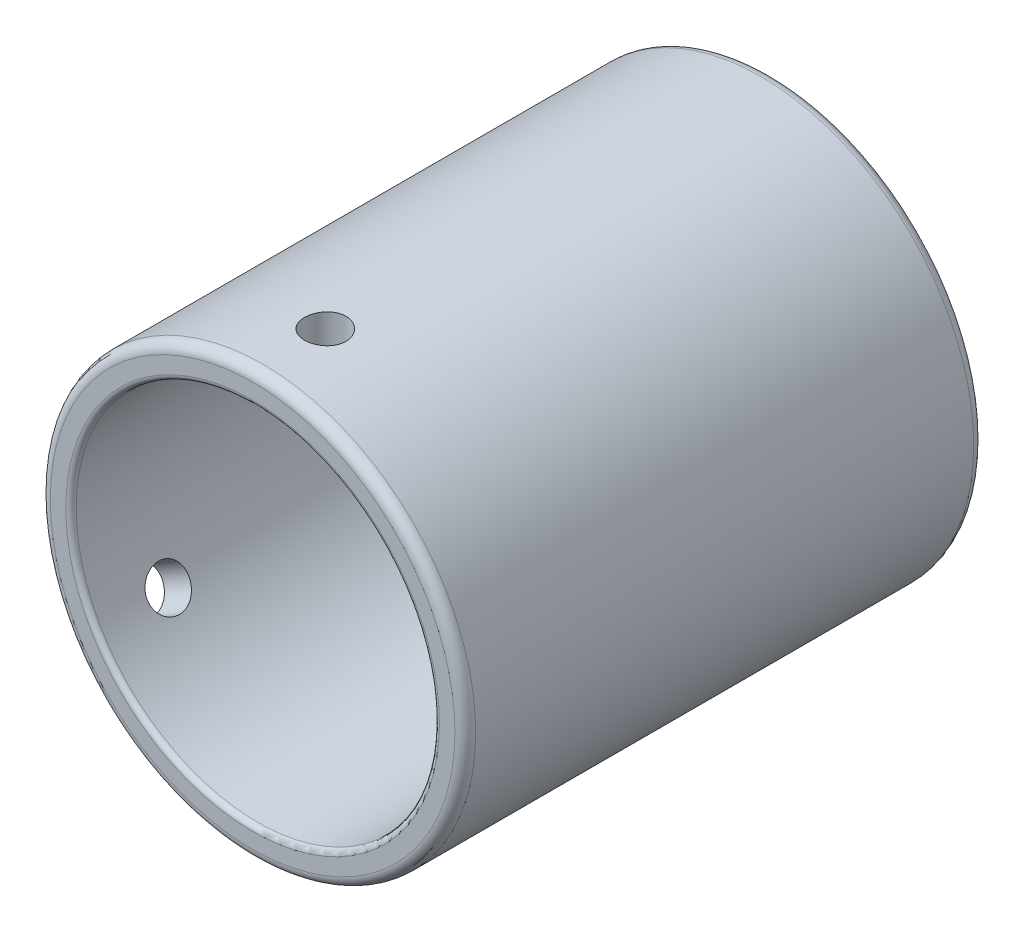
ISO-10303-21;
HEADER;
FILE_DESCRIPTION(('STEP AP214'),'2;1');
FILE_NAME('part.step','',(''),(''),'','','');
FILE_SCHEMA(('AUTOMOTIVE_DESIGN { 1 0 10303 214 1 1 1 1 }'));
ENDSEC;
DATA;
#1=APPLICATION_CONTEXT('core data for automotive mechanical design processes');
#2=APPLICATION_PROTOCOL_DEFINITION('international standard','automotive_design',2000,#1);
#3=PRODUCT_CONTEXT('',#1,'mechanical');
#4=PRODUCT('Part','Part','',(#3));
#5=PRODUCT_RELATED_PRODUCT_CATEGORY('part','',(#4));
#6=PRODUCT_DEFINITION_FORMATION('','',#4);
#7=PRODUCT_DEFINITION_CONTEXT('part definition',#1,'design');
#8=PRODUCT_DEFINITION('design','',#6,#7);
#9=PRODUCT_DEFINITION_SHAPE('','',#8);
#10=(LENGTH_UNIT() NAMED_UNIT(*) SI_UNIT(.MILLI.,.METRE.));
#11=(NAMED_UNIT(*) PLANE_ANGLE_UNIT() SI_UNIT($,.RADIAN.));
#12=(NAMED_UNIT(*) SI_UNIT($,.STERADIAN.) SOLID_ANGLE_UNIT());
#13=UNCERTAINTY_MEASURE_WITH_UNIT(LENGTH_MEASURE(1.E-05),#10,'distance_accuracy_value','');
#14=(GEOMETRIC_REPRESENTATION_CONTEXT(3) GLOBAL_UNCERTAINTY_ASSIGNED_CONTEXT((#13)) GLOBAL_UNIT_ASSIGNED_CONTEXT((#10,
#11,#12)) REPRESENTATION_CONTEXT('',''));
#15=CARTESIAN_POINT('',(0.,0.,0.));
#16=DIRECTION('',(0.,0.,1.));
#17=DIRECTION('',(1.,0.,0.));
#18=AXIS2_PLACEMENT_3D('',#15,#16,#17);
#19=CARTESIAN_POINT('',(0.,0.,-20.));
#20=DIRECTION('',(0.,0.,1.));
#21=DIRECTION('',(1.,0.,0.));
#22=AXIS2_PLACEMENT_3D('',#19,#20,#21);
#23=CYLINDRICAL_SURFACE('',#22,20.5);
#24=CARTESIAN_POINT('',(0.,0.,-19.));
#25=DIRECTION('',(0.,0.,1.));
#26=DIRECTION('',(1.,0.,0.));
#27=AXIS2_PLACEMENT_3D('',#24,#25,#26);
#28=CIRCLE('',#27,20.5);
#29=CARTESIAN_POINT('',(20.5,0.,-19.));
#30=VERTEX_POINT('',#29);
#31=EDGE_CURVE('E72',#30,#30,#28,.T.);
#32=ORIENTED_EDGE('',*,*,#31,.T.);
#33=EDGE_LOOP('',(#32));
#34=FACE_BOUND('',#33,.T.);
#35=CARTESIAN_POINT('',(0.,0.,29.));
#36=DIRECTION('',(0.,0.,1.));
#37=DIRECTION('',(1.,0.,0.));
#38=AXIS2_PLACEMENT_3D('',#35,#36,#37);
#39=CIRCLE('',#38,20.5);
#40=CARTESIAN_POINT('',(20.5,0.,29.));
#41=VERTEX_POINT('',#40);
#42=EDGE_CURVE('E76',#41,#41,#39,.F.);
#43=ORIENTED_EDGE('',*,*,#42,.T.);
#44=EDGE_LOOP('',(#43));
#45=FACE_BOUND('',#44,.T.);
#46=CARTESIAN_POINT('',(0.,20.5,21.));
#47=CARTESIAN_POINT('',(0.112055118297261,20.4999987386317,21.0000048593988));
#48=CARTESIAN_POINT('',(0.224184668309975,20.499071475106,21.0094489636002));
#49=CARTESIAN_POINT('',(0.445336088255295,20.495461599852,21.0469813336016));
#50=CARTESIAN_POINT('',(0.554354379701426,20.492777045632,21.075090231774));
#51=CARTESIAN_POINT('',(0.766048698073126,20.4859556789613,21.1491269722291));
#52=CARTESIAN_POINT('',(0.868728474939646,20.4818197350429,21.1950441595022));
#53=CARTESIAN_POINT('',(1.06490075245513,20.4725582727556,21.3033736252023));
#54=CARTESIAN_POINT('',(1.15839509656164,20.4674329535627,21.3657825845213));
#55=CARTESIAN_POINT('',(1.33388629714277,20.4567473510947,21.5055541918637));
#56=CARTESIAN_POINT('',(1.41584720019146,20.4511857883102,21.5829618878313));
#57=CARTESIAN_POINT('',(1.56563601183513,20.440265125924,21.7504376815717));
#58=CARTESIAN_POINT('',(1.63346327204389,20.43490603562,21.8405063598547));
#59=CARTESIAN_POINT('',(1.75318595977495,20.4249839183537,22.0309713758884));
#60=CARTESIAN_POINT('',(1.80504898753962,20.420422518314,22.1313881715299));
#61=CARTESIAN_POINT('',(1.89116411593102,20.4126279274825,22.3395569917273));
#62=CARTESIAN_POINT('',(1.92541663199883,20.4093947053588,22.4473088431773));
#63=CARTESIAN_POINT('',(1.97523217537074,20.4046339961254,22.6667233177343));
#64=CARTESIAN_POINT('',(1.99085468574775,20.4031010812673,22.7783723161546));
#65=CARTESIAN_POINT('',(2.00315060766216,20.4018976534529,23.0027173911622));
#66=CARTESIAN_POINT('',(1.99982449475686,20.4022270937568,23.1154134414005));
#67=CARTESIAN_POINT('',(1.97436663428334,20.4047062007368,23.338243935767));
#68=CARTESIAN_POINT('',(1.95229978651287,20.4068495855721,23.4483858742493));
#69=CARTESIAN_POINT('',(1.89008781141722,20.4127052572463,23.6633953754961));
#70=CARTESIAN_POINT('',(1.84994245048147,20.4164175643586,23.7682628700848));
#71=CARTESIAN_POINT('',(1.7526412298465,20.4250000260275,23.9699519795444));
#72=CARTESIAN_POINT('',(1.6954565253236,20.4298721411142,24.0667595919421));
#73=CARTESIAN_POINT('',(1.56572061882715,20.440223572557,24.2494277136336));
#74=CARTESIAN_POINT('',(1.49316898890145,20.4457029058215,24.3352879179474));
#75=CARTESIAN_POINT('',(1.33439598480994,20.4566793757017,24.4940011334619));
#76=CARTESIAN_POINT('',(1.2481185525419,20.462176490598,24.5667980787225));
#77=CARTESIAN_POINT('',(1.06453784366295,20.4725474048768,24.6968839513002));
#78=CARTESIAN_POINT('',(0.967234555575785,20.4774212036104,24.7541728624756));
#79=CARTESIAN_POINT('',(0.764325751896327,20.4859978296919,24.8516140005771));
#80=CARTESIAN_POINT('',(0.658718889055996,20.4897004665282,24.8917634398159));
#81=CARTESIAN_POINT('',(0.44221879203114,20.4955156024944,24.953745138046));
#82=CARTESIAN_POINT('',(0.3313257083909,20.4976281468793,24.9755779183415));
#83=CARTESIAN_POINT('',(0.107886619670565,20.500019258317,25.000235550754));
#84=CARTESIAN_POINT('',(-0.00465076973347534,20.500305291138,25.0031377815235));
#85=CARTESIAN_POINT('',(-0.228610375518432,20.4990311576163,24.9900550811019));
#86=CARTESIAN_POINT('',(-0.340032606208692,20.4974710149938,24.9740703925754));
#87=CARTESIAN_POINT('',(-0.558376115530064,20.4926846542083,24.923731784933));
#88=CARTESIAN_POINT('',(-0.665305811782584,20.4894617173387,24.8894140388491));
#89=CARTESIAN_POINT('',(-0.871890422192229,20.4817114137955,24.8034206092611));
#90=CARTESIAN_POINT('',(-0.971545180657102,20.4771840192152,24.7517445544012));
#91=CARTESIAN_POINT('',(-1.1611012962819,20.4673127926895,24.6323090995056));
#92=CARTESIAN_POINT('',(-1.25097044326885,20.4619663961097,24.5644987940307));
#93=CARTESIAN_POINT('',(-1.41807837639946,20.4510654935712,24.4147927993274));
#94=CARTESIAN_POINT('',(-1.49531686095596,20.445510982647,24.3328967738646));
#95=CARTESIAN_POINT('',(-1.6352391099201,20.4347974735107,24.1570067296608));
#96=CARTESIAN_POINT('',(-1.69787213595757,20.4296398945817,24.0629722494476));
#97=CARTESIAN_POINT('',(-1.806456889884,20.420325565535,23.865674446725));
#98=CARTESIAN_POINT('',(-1.85240883634839,20.4161688023037,23.7624112451633));
#99=CARTESIAN_POINT('',(-1.92624184829733,20.4093354686106,23.549762158182));
#100=CARTESIAN_POINT('',(-1.95415324003956,20.4066564152293,23.4403868853055));
#101=CARTESIAN_POINT('',(-1.99121129222791,20.4030740265505,23.2184747902894));
#102=CARTESIAN_POINT('',(-2.00035846262235,20.4021706429962,23.105938054152));
#103=CARTESIAN_POINT('',(-1.99962152986922,20.4022428445945,22.881401828145));
#104=CARTESIAN_POINT('',(-1.98981713237009,20.403210560367,22.7694020656052));
#105=CARTESIAN_POINT('',(-1.9516223500197,20.4068991531074,22.5486486645367));
#106=CARTESIAN_POINT('',(-1.92323194295228,20.4096200321709,22.4398950298884));
#107=CARTESIAN_POINT('',(-1.84869275783853,20.4165062113761,22.2287207086669));
#108=CARTESIAN_POINT('',(-1.80254618103738,20.4206713324678,22.1262992389169));
#109=CARTESIAN_POINT('',(-1.69381289802922,20.4299770492896,21.9306430701679));
#110=CARTESIAN_POINT('',(-1.63122630987085,20.4351176380153,21.8374083052099));
#111=CARTESIAN_POINT('',(-1.49109015247852,20.445820950492,21.6623636819851));
#112=CARTESIAN_POINT('',(-1.4134812275986,20.4513852938365,21.5806014403538));
#113=CARTESIAN_POINT('',(-1.24561975044232,20.4622943497929,21.4312248718465));
#114=CARTESIAN_POINT('',(-1.15536416941485,20.4676390093949,21.3636139437738));
#115=CARTESIAN_POINT('',(-0.96453486672606,20.477519777667,21.2443323754535));
#116=CARTESIAN_POINT('',(-0.863936776040608,20.4820539044482,21.1927005876381));
#117=CARTESIAN_POINT('',(-0.655519466416636,20.4897809682009,21.1071301224197));
#118=CARTESIAN_POINT('',(-0.547708571075021,20.4929754212287,21.0731714345133));
#119=CARTESIAN_POINT('',(-0.36606935911458,20.4968577956736,21.0324073778325));
#120=CARTESIAN_POINT('',(-0.293403317049334,20.4980306482258,21.0202711442945));
#121=CARTESIAN_POINT('',(-0.147168884711894,20.4996021631359,21.0040658751404));
#122=CARTESIAN_POINT('',(-0.0736004979412026,20.500000828497,20.9999968082299));
#123=CARTESIAN_POINT('',(0.,20.5,21.));
#124=B_SPLINE_CURVE_WITH_KNOTS('',3,(#46,#47,#48,#49,#50,#51,#52,#53,#54,#55,#56,#57,#58,#59,
#60,#61,#62,#63,#64,#65,#66,#67,#68,#69,#70,#71,#72,#73,#74,#75,#76,#77,#78,#79,#80,#81,#82,#83,
#84,#85,#86,#87,#88,#89,#90,#91,#92,#93,#94,#95,#96,#97,#98,#99,#100,#101,#102,#103,#104,#105,
#106,#107,#108,#109,#110,#111,#112,#113,#114,#115,#116,#117,#118,#119,#120,#121,#122,#123),
.UNSPECIFIED.,.T.,.F.,(4,2,2,2,2,2,2,2,2,2,2,2,2,2,2,2,2,2,2,2,2,2,2,2,2,2,2,2,2,2,2,2,2,2,2,2,
2,2,4),(0.,0.335896599613497,0.672165124399248,1.00823276348817,1.34423281758225,
1.68125812727404,2.01829889472738,2.35601925108154,2.69373164007187,3.03036284743265,
3.36698560633152,3.70244736052759,4.03791344968535,4.37395068598548,4.70999728178776,
5.04745334324658,5.38490975594947,5.72242103410455,6.059922706139,6.39604397039323,
6.73216091610808,7.06761710439,7.40308046972677,7.7396166341872,8.07616083307704,
8.41385730311551,8.75154934809143,9.08867224454342,9.42578597900947,9.76148498018371,
10.097184382625,10.4328421815703,10.7684975703674,11.105507305527,11.442597889628,
11.7805017665503,12.1180222122315,12.3386480369782,12.5592730058683),.UNSPECIFIED.);
#125=CARTESIAN_POINT('',(0.,20.5,21.));
#126=VERTEX_POINT('',#125);
#127=EDGE_CURVE('E80',#126,#126,#124,.T.);
#128=ORIENTED_EDGE('',*,*,#127,.T.);
#129=EDGE_LOOP('',(#128));
#130=FACE_BOUND('',#129,.T.);
#131=CARTESIAN_POINT('',(-17.7535207775809,-10.2500000000001,21.));
#132=CARTESIAN_POINT('',(-17.8095472443526,-10.1529567902465,21.0000048593988));
#133=CARTESIAN_POINT('',(-17.8648089855897,-10.0553861196577,21.0094489636002));
#134=CARTESIAN_POINT('',(-17.9722584518879,-9.86205843427499,21.0469813336016));
#135=CARTESIAN_POINT('',(-18.0244427054586,-9.76630354729549,21.075090231774));
#136=CARTESIAN_POINT('',(-18.1243823878191,-9.57956020641342,21.1491269722291));
#137=CARTESIAN_POINT('',(-18.1721404437504,-9.48856893923288,21.1950441595022));
#138=CARTESIAN_POINT('',(-18.2622059208911,-9.31404803224257,21.3033736252023));
#139=CARTESIAN_POINT('',(-18.3045144363209,-9.23051689553974,21.3657825845213));
#140=CARTESIAN_POINT('',(-18.3830060334194,-9.07319425646183,21.5055541918637));
#141=CARTESIAN_POINT('',(-18.4191700302876,-8.9994332509123,21.5829618878313));
#142=CARTESIAN_POINT('',(-18.4846068650568,-8.8642520036331,21.7504376815717));
#143=CARTESIAN_POINT('',(-18.5138793868168,-8.80283232807125,21.8405063598547));
#144=CARTESIAN_POINT('',(-18.5651479250703,-8.69418838045362,22.0309713758884));
#145=CARTESIAN_POINT('',(-18.5871291506415,-8.64699298087237,22.1313881715299));
#146=CARTESIAN_POINT('',(-18.623436401165,-8.56851779661955,22.3395569917273));
#147=CARTESIAN_POINT('',(-18.6377626067037,-8.53723763649942,22.4473088431773));
#148=CARTESIAN_POINT('',(-18.6585474832535,-8.49171575581933,22.6667233177343));
#149=CARTESIAN_POINT('',(-18.665031195233,-8.47741980753288,22.7783723161546));
#150=CARTESIAN_POINT('',(-18.6701369571314,-8.46616951288487,23.0027173911622));
#151=CARTESIAN_POINT('',(-18.6687592043509,-8.46921473130865,23.1154134414005));
#152=CARTESIAN_POINT('',(-18.6581772437375,-8.49250143869471,23.338243935767));
#153=CARTESIAN_POINT('',(-18.6490000455698,-8.51268358186308,23.4483858742493));
#154=CARTESIAN_POINT('',(-18.622965218448,-8.56948856855259,23.6633953754961));
#155=CARTESIAN_POINT('',(-18.6061074902461,-8.60611162452322,23.7682628700848));
#156=CARTESIAN_POINT('',(-18.5648895097609,-8.69466818424677,23.9699519795444));
#157=CARTESIAN_POINT('',(-18.5405165329346,-8.74662764861486,24.0667595919421));
#158=CARTESIAN_POINT('',(-18.4846131822814,-8.8641579551452,24.2494277136336));
#159=CARTESIAN_POINT('',(-18.4530826091214,-8.92972917637905,24.3352879179474));
#160=CARTESIAN_POINT('',(-18.3832020088358,-9.07271886629758,24.4940011334619));
#161=CARTESIAN_POINT('',(-18.3448239338495,-9.15018587186315,24.5667980787225));
#162=CARTESIAN_POINT('',(-18.2620150546359,-9.31435688653645,24.6968839513002));
#163=CARTESIAN_POINT('',(-18.2175842441086,-9.40106090525851,24.7541728624756));
#164=CARTESIAN_POINT('',(-18.1235574183342,-9.58107339693719,24.8516140005771));
#165=CARTESIAN_POINT('',(-18.0739605644753,-9.67438294138904,24.8917634398159));
#166=CARTESIAN_POINT('',(-17.970746571436,-9.86478509331747,24.953745138046));
#167=CARTESIAN_POINT('',(-17.9171295467198,-9.96187759304633,24.9755779183415));
#168=CARTESIAN_POINT('',(-17.807480765608,-10.1565770757955,25.000235550754));
#169=CARTESIAN_POINT('',(-17.7514597825953,-10.2541803303054,25.0031377815235));
#170=CARTESIAN_POINT('',(-17.6383765477052,-10.4474979715759,24.9900550811019));
#171=CARTESIAN_POINT('',(-17.5813143092155,-10.5432123825888,24.9740703925754));
#172=CARTESIAN_POINT('',(-17.4679974445228,-10.7299102280197,24.923731784933));
#173=CARTESIAN_POINT('',(-17.4117414511927,-10.8209025929586,24.8894140388491));
#174=CARTESIAN_POINT('',(-17.3017371862324,-10.9959349618326,24.8034206092611));
#175=CARTESIAN_POINT('',(-17.2479889682805,-11.0799748169811,24.7517445544012));
#176=CARTESIAN_POINT('',(-17.1446621775303,-11.239199615292,24.6323090995056));
#177=CARTESIAN_POINT('',(-17.0950974887801,-11.3143553813093,24.5644987940307));
#178=CARTESIAN_POINT('',(-17.0021030636922,-11.453624645305,24.4147927993274));
#179=CARTESIAN_POINT('',(-16.958673473848,-11.5177378796186,24.3328967738646));
#180=CARTESIAN_POINT('',(-16.8794341782902,-11.6335573472081,24.1570067296608));
#181=CARTESIAN_POINT('',(-16.8436510708969,-11.6852203494079,24.0629722494476));
#182=CARTESIAN_POINT('',(-16.7812922483601,-11.7746003402485,23.865674446725));
#183=CARTESIAN_POINT('',(-16.754716412572,-11.8123175116244,23.7624112451633));
#184=CARTESIAN_POINT('',(-16.7118820660268,-11.8728421087635,23.549762158182));
#185=CARTESIAN_POINT('',(-16.6956062418694,-11.8956745563767,23.4403868853055));
#186=CARTESIAN_POINT('',(-16.6739747761731,-11.9259765766471,23.2184747902894));
#187=CARTESIAN_POINT('',(-16.6686188378686,-11.9334465668043,23.105938054152));
#188=CARTESIAN_POINT('',(-16.6690498326635,-11.9328444651184,22.881401828145));
#189=CARTESIAN_POINT('',(-16.6747900978557,-11.9248374657016,22.7694020656052));
#190=CARTESIAN_POINT('',(-16.6970819040483,-11.8936041102643,22.5486486645367));
#191=CARTESIAN_POINT('',(-16.7136334579716,-11.8703777360519,22.4398950298884));
#192=CARTESIAN_POINT('',(-16.7568666566552,-11.8092679977686,22.2287207086669));
#193=CARTESIAN_POINT('',(-16.7835470457309,-11.771386450507,22.1262992389169));
#194=CARTESIAN_POINT('',(-16.8459726744032,-11.6818735235959,21.9306430701679));
#195=CARTESIAN_POINT('',(-16.8817178489092,-11.6302422426774,21.8374083052099));
#196=CARTESIAN_POINT('',(-16.9610552681149,-11.5142324266253,21.6623636819851));
#197=CARTESIAN_POINT('',(-17.0046785932466,-11.4498032977912,21.5806014403538));
#198=CARTESIAN_POINT('',(-17.0980568514142,-11.3098855222352,21.4312248718465));
#199=CARTESIAN_POINT('',(-17.1478132529179,-11.2343942260331,21.3636139437738));
#200=CARTESIAN_POINT('',(-17.2517849005948,-11.0740715862542,21.2443323754535));
#201=CARTESIAN_POINT('',(-17.306010614914,-10.989218147539,21.1927005876381));
#202=CARTESIAN_POINT('',(-17.4169111032325,-10.8125869946926,21.1071301224197));
#203=CARTESIAN_POINT('',(-17.4735830283766,-10.7208172470359,21.0731714345133));
#204=CARTESIAN_POINT('',(-17.5677648692531,-10.5654542623772,21.0324073778325));
#205=CARTESIAN_POINT('',(-17.6051136103909,-10.5031100502323,21.0202711442945));
#206=CARTESIAN_POINT('',(-17.6795917983941,-10.3772530743752,21.0040658751404));
#207=CARTESIAN_POINT('',(-17.7167212461098,-10.3137403151969,20.9999968082299));
#208=CARTESIAN_POINT('',(-17.7535207775809,-10.2500000000001,21.));
#209=B_SPLINE_CURVE_WITH_KNOTS('',3,(#131,#132,#133,#134,#135,#136,#137,#138,#139,#140,#141,
#142,#143,#144,#145,#146,#147,#148,#149,#150,#151,#152,#153,#154,#155,#156,#157,#158,#159,#160,
#161,#162,#163,#164,#165,#166,#167,#168,#169,#170,#171,#172,#173,#174,#175,#176,#177,#178,#179,
#180,#181,#182,#183,#184,#185,#186,#187,#188,#189,#190,#191,#192,#193,#194,#195,#196,#197,#198,
#199,#200,#201,#202,#203,#204,#205,#206,#207,#208),.UNSPECIFIED.,.T.,.F.,(4,2,2,2,2,2,2,2,2,2,2,
2,2,2,2,2,2,2,2,2,2,2,2,2,2,2,2,2,2,2,2,2,2,2,2,2,2,2,4),(0.,0.335896599613497,
0.672165124399248,1.00823276348817,1.34423281758225,1.68125812727404,2.01829889472738,
2.35601925108154,2.69373164007187,3.03036284743265,3.36698560633152,3.70244736052759,
4.03791344968535,4.37395068598548,4.70999728178776,5.04745334324658,5.38490975594948,
5.72242103410455,6.05992270613901,6.39604397039323,6.73216091610809,7.06761710439,
7.40308046972677,7.7396166341872,8.07616083307704,8.41385730311551,8.75154934809143,
9.08867224454342,9.42578597900947,9.76148498018371,10.097184382625,10.4328421815703,
10.7684975703674,11.105507305527,11.442597889628,11.7805017665503,12.1180222122315,
12.3386480369782,12.5592730058683),.UNSPECIFIED.);
#210=CARTESIAN_POINT('',(-17.7535207775809,-10.2500000000001,21.));
#211=VERTEX_POINT('',#210);
#212=EDGE_CURVE('E157',#211,#211,#209,.T.);
#213=ORIENTED_EDGE('',*,*,#212,.T.);
#214=EDGE_LOOP('',(#213));
#215=FACE_BOUND('',#214,.T.);
#216=ADVANCED_FACE('F40',(#34,#45,#130,#215),#23,.T.);
#217=CARTESIAN_POINT('',(0.,0.,-20.));
#218=DIRECTION('',(0.,0.,1.));
#219=DIRECTION('',(1.,0.,0.));
#220=AXIS2_PLACEMENT_3D('',#217,#218,#219);
#221=CYLINDRICAL_SURFACE('',#220,17.5);
#222=CARTESIAN_POINT('',(0.,0.,-19.5));
#223=DIRECTION('',(0.,0.,1.));
#224=DIRECTION('',(1.,0.,0.));
#225=AXIS2_PLACEMENT_3D('',#222,#223,#224);
#226=CIRCLE('',#225,17.5);
#227=CARTESIAN_POINT('',(17.5,0.,-19.5));
#228=VERTEX_POINT('',#227);
#229=EDGE_CURVE('E48',#228,#228,#226,.F.);
#230=ORIENTED_EDGE('',*,*,#229,.T.);
#231=EDGE_LOOP('',(#230));
#232=FACE_BOUND('',#231,.T.);
#233=CARTESIAN_POINT('',(0.,0.,29.5));
#234=DIRECTION('',(0.,0.,1.));
#235=DIRECTION('',(1.,0.,0.));
#236=AXIS2_PLACEMENT_3D('',#233,#234,#235);
#237=CIRCLE('',#236,17.5);
#238=CARTESIAN_POINT('',(17.5,0.,29.5));
#239=VERTEX_POINT('',#238);
#240=EDGE_CURVE('E53',#239,#239,#237,.T.);
#241=ORIENTED_EDGE('',*,*,#240,.T.);
#242=EDGE_LOOP('',(#241));
#243=FACE_BOUND('',#242,.T.);
#244=CARTESIAN_POINT('',(0.,17.5,21.));
#245=CARTESIAN_POINT('',(0.111949281131271,17.4999985510682,21.0000048002778));
#246=CARTESIAN_POINT('',(0.223970370284168,17.4989143966958,21.0094311530867));
#247=CARTESIAN_POINT('',(0.444900622583234,17.4946937577693,21.0468888856655));
#248=CARTESIAN_POINT('',(0.553806324423904,17.4915550764498,21.0749401802739));
#249=CARTESIAN_POINT('',(0.765274995712129,17.4835792974507,21.1488150604572));
#250=CARTESIAN_POINT('',(0.867841986694446,17.4787432899077,21.1946272407723));
#251=CARTESIAN_POINT('',(1.06381060236177,17.4679120331755,21.3026997407102));
#252=CARTESIAN_POINT('',(1.15721390847253,17.4619169972561,21.3649570350827));
#253=CARTESIAN_POINT('',(1.33265783514777,17.4494069384049,21.5044617237074));
#254=CARTESIAN_POINT('',(1.41464987662083,17.4428898679339,21.5817700343795));
#255=CARTESIAN_POINT('',(1.5645257957997,17.4300869526196,21.7490517563352));
#256=CARTESIAN_POINT('',(1.63240898570475,17.4238011190613,21.8390257847088));
#257=CARTESIAN_POINT('',(1.75231750467917,17.4121519566138,22.029395767459));
#258=CARTESIAN_POINT('',(1.80429797266076,17.4067912557056,22.129820153164));
#259=CARTESIAN_POINT('',(1.89063905410776,17.3976257108765,22.3380439624315));
#260=CARTESIAN_POINT('',(1.92500022892039,17.3938208173886,22.4458431509103));
#261=CARTESIAN_POINT('',(1.97498120601606,17.3882168566912,22.6652558132045));
#262=CARTESIAN_POINT('',(1.99068245631194,17.3864090748178,22.7768505072263));
#263=CARTESIAN_POINT('',(2.00314979639016,17.3849772070577,23.0011045934171));
#264=CARTESIAN_POINT('',(1.99991652712141,17.3853530472536,23.1137639494174));
#265=CARTESIAN_POINT('',(1.9746735877826,17.3882379876878,23.3363845769511));
#266=CARTESIAN_POINT('',(1.95275327430006,17.3907369355841,23.4463561307921));
#267=CARTESIAN_POINT('',(1.89089772862114,17.3975706833085,23.6610493810984));
#268=CARTESIAN_POINT('',(1.85096218648165,17.4019055147219,23.7657709872065));
#269=CARTESIAN_POINT('',(1.75411258690629,17.4119342022004,23.9672714090633));
#270=CARTESIAN_POINT('',(1.697159329054,17.4176311898808,24.0640312212313));
#271=CARTESIAN_POINT('',(1.5679190891396,17.4297397716759,24.2466532927437));
#272=CARTESIAN_POINT('',(1.49563152051157,17.4361513931222,24.3325151350196));
#273=CARTESIAN_POINT('',(1.33727766100704,17.4490120091816,24.4914228916927));
#274=CARTESIAN_POINT('',(1.25113428048549,17.455461005996,24.5643920069767));
#275=CARTESIAN_POINT('',(1.06778054344645,17.4676349914203,24.6948462536218));
#276=CARTESIAN_POINT('',(0.970570168013121,17.4733599787928,24.7523313585169));
#277=CARTESIAN_POINT('',(0.767785399909198,17.4834436495983,24.8501844179875));
#278=CARTESIAN_POINT('',(0.662208868897606,17.4878019823021,24.8905479795388));
#279=CARTESIAN_POINT('',(0.445716005555923,17.4946579437091,24.9529533503239));
#280=CARTESIAN_POINT('',(0.334799882177868,17.4971556451608,24.9749958758915));
#281=CARTESIAN_POINT('',(0.111440847189142,17.4999995196358,25.0000348919418));
#282=CARTESIAN_POINT('',(-0.00099004926388521,17.5003576527763,25.0031372594291));
#283=CARTESIAN_POINT('',(-0.224770143214529,17.4989142301576,24.9904867007736));
#284=CARTESIAN_POINT('',(-0.336119359859264,17.4971127126976,24.9747341090033));
#285=CARTESIAN_POINT('',(-0.554265994438543,17.4915599395696,24.9249086964044));
#286=CARTESIAN_POINT('',(-0.661074995715398,17.4878140135584,24.890885945634));
#287=CARTESIAN_POINT('',(-0.867470606546541,17.4787921749894,24.8055377776234));
#288=CARTESIAN_POINT('',(-0.967057008006426,17.4735162183709,24.7542118620924));
#289=CARTESIAN_POINT('',(-1.1566560556988,17.4619935546906,24.6354552393353));
#290=CARTESIAN_POINT('',(-1.24662524248109,17.4557427309721,24.5679555536887));
#291=CARTESIAN_POINT('',(-1.41399482686995,17.4429836190554,24.4188656405942));
#292=CARTESIAN_POINT('',(-1.49139480973755,17.4364753223705,24.3372749483764));
#293=CARTESIAN_POINT('',(-1.63180089287333,17.4238982965486,24.1618546755983));
#294=CARTESIAN_POINT('',(-1.69473712215655,17.4178317940395,24.0679689878693));
#295=CARTESIAN_POINT('',(-1.80394755942105,17.4068606742744,23.8708980779497));
#296=CARTESIAN_POINT('',(-1.85022205420212,17.4019560370195,23.7677130158681));
#297=CARTESIAN_POINT('',(-1.92468057699606,17.3938786287494,23.5552042872352));
#298=CARTESIAN_POINT('',(-1.9529049884149,17.3907019940762,23.4458949232105));
#299=CARTESIAN_POINT('',(-1.99059267414119,17.3864287991637,23.2240499890747));
#300=CARTESIAN_POINT('',(-2.00005666745658,17.385332159207,23.1115145427737));
#301=CARTESIAN_POINT('',(-1.99994314687055,17.385345163739,22.8871066923611));
#302=CARTESIAN_POINT('',(-1.99047539100516,17.3864420908835,22.7752342159769));
#303=CARTESIAN_POINT('',(-1.95299850876729,17.3906913968281,22.5546810119119));
#304=CARTESIAN_POINT('',(-1.92498937098975,17.3938437768924,22.4460002861945));
#305=CARTESIAN_POINT('',(-1.85125733006852,17.4018450488478,22.2349239566377));
#306=CARTESIAN_POINT('',(-1.80553879088569,17.4066935227579,22.1325268115905));
#307=CARTESIAN_POINT('',(-1.69769666392679,17.4175414489812,21.9368408183938));
#308=CARTESIAN_POINT('',(-1.63557300493567,17.4235409062907,21.8435520097863));
#309=CARTESIAN_POINT('',(-1.496274276119,17.4360565183282,21.6681688663739));
#310=CARTESIAN_POINT('',(-1.41901733601474,17.4425753637158,21.5861397460944));
#311=CARTESIAN_POINT('',(-1.25181311513089,17.4553710614581,21.4361657260599));
#312=CARTESIAN_POINT('',(-1.16186282631113,17.4616478560018,21.3682241741951));
#313=CARTESIAN_POINT('',(-0.971500170550115,17.4732739611811,21.248173827669));
#314=CARTESIAN_POINT('',(-0.871055194164787,17.478620234515,21.1961164789324));
#315=CARTESIAN_POINT('',(-0.662847939396797,17.4877513427388,21.1096797878848));
#316=CARTESIAN_POINT('',(-0.555093898848711,17.4915379025678,21.0752809060603));
#317=CARTESIAN_POINT('',(-0.372298085692647,17.4961924479184,21.0335288977349));
#318=CARTESIAN_POINT('',(-0.298416630910324,17.4976134605341,21.0209732212439));
#319=CARTESIAN_POINT('',(-0.149700818660187,17.499517718344,21.0042071914803));
#320=CARTESIAN_POINT('',(-0.074866466722564,17.5000009689781,20.9999967897977));
#321=CARTESIAN_POINT('',(0.,17.5,21.));
#322=B_SPLINE_CURVE_WITH_KNOTS('',3,(#244,#245,#246,#247,#248,#249,#250,#251,#252,#253,#254,
#255,#256,#257,#258,#259,#260,#261,#262,#263,#264,#265,#266,#267,#268,#269,#270,#271,#272,#273,
#274,#275,#276,#277,#278,#279,#280,#281,#282,#283,#284,#285,#286,#287,#288,#289,#290,#291,#292,
#293,#294,#295,#296,#297,#298,#299,#300,#301,#302,#303,#304,#305,#306,#307,#308,#309,#310,#311,
#312,#313,#314,#315,#316,#317,#318,#319,#320,#321),.UNSPECIFIED.,.T.,.F.,(4,2,2,2,2,2,2,2,2,2,2,
2,2,2,2,2,2,2,2,2,2,2,2,2,2,2,2,2,2,2,2,2,2,2,2,2,2,2,4),(0.,0.33557441666428,0.671508227518323,
1.00722667281621,1.34288340216198,1.67992799894877,2.01698902267013,2.3549922992977,
2.69298480653802,3.0294965400225,3.36599688237659,3.7008971352324,4.03580315010127,
4.3714866496878,4.7071829921089,5.04481612297898,5.38244983094422,5.72017011621976,
6.05787719635448,6.39369472529332,6.72950629895979,7.06440223033913,7.39930780676431,
7.73566795085562,8.07203919137998,8.41000271890797,8.74796042876379,9.08515935679785,
9.42234536116483,9.75758217571838,10.0928191964809,10.4279736604432,10.763129579344,
11.100151413458,11.4372532487619,11.7754355791756,12.1132428917892,12.3376607387197,
12.5620772838218),.UNSPECIFIED.);
#323=CARTESIAN_POINT('',(0.,17.5,21.));
#324=VERTEX_POINT('',#323);
#325=EDGE_CURVE('E81',#324,#324,#322,.T.);
#326=ORIENTED_EDGE('',*,*,#325,.F.);
#327=EDGE_LOOP('',(#326));
#328=FACE_BOUND('',#327,.T.);
#329=CARTESIAN_POINT('',(-15.1554445662276,-8.75000000000007,21.));
#330=CARTESIAN_POINT('',(-15.2114179519816,-8.65304835413911,21.0000048002778));
#331=CARTESIAN_POINT('',(-15.2664895913299,-8.55549316798689,21.0094311530867));
#332=CARTESIAN_POINT('',(-15.3732995369488,-8.36205163756812,21.0468888856655));
#333=CARTESIAN_POINT('',(-15.4250342101121,-8.2661671924974,21.0749401802739));
#334=CARTESIAN_POINT('',(-15.5238613185281,-8.07904206155771,21.1488150604572));
#335=CARTESIAN_POINT('',(-15.5709567086341,-7.98779843800578,21.1946272407723));
#336=CARTESIAN_POINT('',(-15.6595608729827,-7.81266901012732,21.3026997407102));
#337=CARTESIAN_POINT('',(-15.7010706726353,-7.72878185627821,21.3649570350827));
#338=CARTESIAN_POINT('',(-15.777958607205,-7.57058792941219,21.5044617237074));
#339=CARTESIAN_POINT('',(-15.8133106793553,-7.49632220335286,21.5817700343795));
#340=CARTESIAN_POINT('',(-15.8771609890401,-7.36012439227126,21.7490517563352));
#341=CARTESIAN_POINT('',(-15.9056588924472,-7.29819290854442,21.8390257847088));
#342=CARTESIAN_POINT('',(-15.955524681322,-7.18852450375864,22.029395767459));
#343=CARTESIAN_POINT('',(-15.9768724121443,-7.14082774753191,22.129820153164));
#344=CARTESIAN_POINT('',(-16.0121053582062,-7.06147140519404,22.3380439624315));
#345=CARTESIAN_POINT('',(-16.0259908111933,-7.02981130815847,22.4458431509103));
#346=CARTESIAN_POINT('',(-16.0461281274153,-6.98372453193892,22.6652558132045));
#347=CARTESIAN_POINT('',(-16.0524131675364,-6.96922295937481,22.7768505072263));
#348=CARTESIAN_POINT('',(-16.0574068037204,-6.9577099922694,23.0011045934171));
#349=CARTESIAN_POINT('',(-16.0561156562435,-6.96069800569137,23.1137639494174));
#350=CARTESIAN_POINT('',(-16.0459926182785,-6.9840015026421,23.3363845769511));
#351=CARTESIAN_POINT('',(-16.0371966138982,-7.00423452492503,23.4463561307921));
#352=CARTESIAN_POINT('',(-16.0121870401911,-7.0612198727101,23.6610493810984));
#353=CARTESIAN_POINT('',(-15.9959733432465,-7.09797248242354,23.7657709872065));
#354=CARTESIAN_POINT('',(-15.9562336415818,-7.18686103974138,23.9672714090633));
#355=CARTESIAN_POINT('',(-15.9326907487119,-7.23903250170993,24.0640312212313));
#356=CARTESIAN_POINT('',(-15.878556968193,-7.35701212356455,24.2466532927437));
#357=CARTESIAN_POINT('',(-15.847965810931,-7.42282080509742,24.3325151350196));
#358=CARTESIAN_POINT('',(-15.7799265013945,-7.56638957824536,24.4914228916927));
#359=CARTESIAN_POINT('',(-15.7424398062039,-7.64421643255205,24.5643920069767));
#360=CARTESIAN_POINT('',(-15.6613059183271,-7.80909241941883,24.6948462536218));
#361=CARTESIAN_POINT('',(-15.6176587151114,-7.89614156774176,24.7523313585169));
#362=CARTESIAN_POINT('',(-15.5249990461404,-8.07680016382305,24.8501844179875));
#363=CARTESIAN_POINT('',(-15.4759852074742,-8.17041128807441,24.8905479795388));
#364=CARTESIAN_POINT('',(-15.3736762125492,-8.36132758816987,24.9529533503239));
#365=CARTESIAN_POINT('',(-15.3203812237684,-8.45863261943039,24.9749958758915));
#366=CARTESIAN_POINT('',(-15.2111645738146,-8.65348915513294,25.0000348919418));
#367=CARTESIAN_POINT('',(-15.1552592779857,-8.75103623420173,25.0031372594291));
#368=CARTESIAN_POINT('',(-15.0421191903542,-8.94411376911494,24.9904867007736));
#369=CARTESIAN_POINT('',(-14.9848844221461,-9.03964426069078,24.9747341090033));
#370=CARTESIAN_POINT('',(-14.8710022622661,-9.22578840142247,24.9249086964044));
#371=CARTESIAN_POINT('',(-14.8143536945414,-9.3164147468755,24.890885945634));
#372=CARTESIAN_POINT('',(-14.7033427477362,-9.49064766980039,24.8055377776234));
#373=CARTESIAN_POINT('',(-14.6489804345453,-9.57425404502685,24.7542118620924));
#374=CARTESIAN_POINT('',(-14.5442019912328,-9.73269030502165,24.6354552393353));
#375=CARTESIAN_POINT('',(-14.4938040257068,-9.80748049447365,24.5679555536887));
#376=CARTESIAN_POINT('',(-14.3990695184628,-9.94604725041694,24.4188656405942));
#377=CARTESIAN_POINT('',(-14.3547331767645,-10.0098234534903,24.3372749483764));
#378=CARTESIAN_POINT('',(-14.2736381113308,-10.1251301754208,24.1618546755983));
#379=CARTESIAN_POINT('',(-14.2369162514042,-10.1766012975439,24.0679689878693));
#380=CARTESIAN_POINT('',(-14.1728097643473,-10.2656947506908,23.8708980779497));
#381=CARTESIAN_POINT('',(-14.1454249764977,-10.3033173200911,23.7677130158681));
#382=CARTESIAN_POINT('',(-14.1012004743421,-10.3637615882238,23.5552042872352));
#383=CARTESIAN_POINT('',(-14.0843372223072,-10.3866163281828,23.4458949232105));
#384=CARTESIAN_POINT('',(-14.0617926840945,-10.4171182239754,23.2240499890747));
#385=CARTESIAN_POINT('',(-14.0561109693755,-10.4247659626294,23.1115145427737));
#386=CARTESIAN_POINT('',(-14.0561789919236,-10.4246741531841,22.8871066923611));
#387=CARTESIAN_POINT('',(-14.0618628366296,-10.4170232996601,22.7752342159769));
#388=CARTESIAN_POINT('',(-14.0842812846449,-10.3866920205597,22.5546810119119));
#389=CARTESIAN_POINT('',(-14.1010158947518,-10.3640115857384,22.4460002861945));
#390=CARTESIAN_POINT('',(-14.1448112199883,-10.3041584012055,22.2349239566377));
#391=CARTESIAN_POINT('',(-14.1718693911555,-10.2669892218043,22.1325268115905));
#392=CARTESIAN_POINT('',(-14.2351850343227,-10.1790191633713,21.9368408183938));
#393=CARTESIAN_POINT('',(-14.2714425462572,-10.1282182251638,21.8435520097863));
#394=CARTESIAN_POINT('',(-14.351930748634,-10.0138397933124,21.6681688663739));
#395=CARTESIAN_POINT('',(-14.3962047043951,-9.95019274325728,21.5861397460944));
#396=CARTESIAN_POINT('',(-14.4908882141409,-9.81178748922299,21.4361657260599));
#397=CARTESIAN_POINT('',(-14.54129922208,-9.7370266512992,21.3682241741951));
#398=CARTESIAN_POINT('',(-14.6465490523929,-9.57798080806793,21.248173827669));
#399=CARTESIAN_POINT('',(-14.7014015491082,-9.49366604350264,21.1961164789324));
#400=CARTESIAN_POINT('',(-14.8134129481788,-9.31791882573328,21.1096797878848));
#401=CARTESIAN_POINT('',(-14.8705692254577,-9.22649436917271,21.0752809060603));
#402=CARTESIAN_POINT('',(-14.9659980865524,-9.0705158239494,21.0335288977349));
#403=CARTESIAN_POINT('',(-15.0041694469679,-9.00724311354722,21.0209732212439));
#404=CARTESIAN_POINT('',(-15.0801764887317,-8.87940357109913,21.0042071914803));
#405=CARTESIAN_POINT('',(-15.118012172026,-8.81483674656244,20.9999967897977));
#406=CARTESIAN_POINT('',(-15.1554445662276,-8.75000000000007,21.));
#407=B_SPLINE_CURVE_WITH_KNOTS('',3,(#329,#330,#331,#332,#333,#334,#335,#336,#337,#338,#339,
#340,#341,#342,#343,#344,#345,#346,#347,#348,#349,#350,#351,#352,#353,#354,#355,#356,#357,#358,
#359,#360,#361,#362,#363,#364,#365,#366,#367,#368,#369,#370,#371,#372,#373,#374,#375,#376,#377,
#378,#379,#380,#381,#382,#383,#384,#385,#386,#387,#388,#389,#390,#391,#392,#393,#394,#395,#396,
#397,#398,#399,#400,#401,#402,#403,#404,#405,#406),.UNSPECIFIED.,.T.,.F.,(4,2,2,2,2,2,2,2,2,2,2,
2,2,2,2,2,2,2,2,2,2,2,2,2,2,2,2,2,2,2,2,2,2,2,2,2,2,2,4),(0.,0.335574416664279,
0.671508227518323,1.00722667281621,1.34288340216198,1.67992799894876,2.01698902267013,
2.35499229929769,2.69298480653802,3.0294965400225,3.36599688237659,3.7008971352324,
4.03580315010127,4.3714866496878,4.7071829921089,5.04481612297898,5.38244983094421,
5.72017011621976,6.05787719635448,6.39369472529332,6.72950629895979,7.06440223033913,
7.3993078067643,7.73566795085562,8.07203919137998,8.41000271890796,8.74796042876379,
9.08515935679785,9.42234536116483,9.75758217571838,10.0928191964809,10.4279736604432,
10.763129579344,11.1001514134581,11.4372532487619,11.7754355791757,12.1132428917892,
12.3376607387197,12.5620772838218),.UNSPECIFIED.);
#408=CARTESIAN_POINT('',(-15.1554445662276,-8.75000000000007,21.));
#409=VERTEX_POINT('',#408);
#410=EDGE_CURVE('E90',#409,#409,#407,.T.);
#411=ORIENTED_EDGE('',*,*,#410,.F.);
#412=EDGE_LOOP('',(#411));
#413=FACE_BOUND('',#412,.T.);
#414=ADVANCED_FACE('F96',(#232,#243,#328,#413),#221,.F.);
#415=CARTESIAN_POINT('',(0.,0.,-20.));
#416=DIRECTION('',(0.,0.,1.));
#417=DIRECTION('',(1.,0.,0.));
#418=AXIS2_PLACEMENT_3D('',#415,#416,#417);
#419=PLANE('',#418);
#420=CARTESIAN_POINT('',(0.,0.,-20.));
#421=DIRECTION('',(0.,0.,1.));
#422=DIRECTION('',(1.,0.,0.));
#423=AXIS2_PLACEMENT_3D('',#420,#421,#422);
#424=CIRCLE('',#423,18.);
#425=CARTESIAN_POINT('',(18.,0.,-20.));
#426=VERTEX_POINT('',#425);
#427=EDGE_CURVE('E58',#426,#426,#424,.T.);
#428=ORIENTED_EDGE('',*,*,#427,.T.);
#429=EDGE_LOOP('',(#428));
#430=FACE_BOUND('',#429,.T.);
#431=CARTESIAN_POINT('',(0.,0.,-20.));
#432=DIRECTION('',(0.,0.,1.));
#433=DIRECTION('',(1.,0.,0.));
#434=AXIS2_PLACEMENT_3D('',#431,#432,#433);
#435=CIRCLE('',#434,19.5);
#436=CARTESIAN_POINT('',(19.5,0.,-20.));
#437=VERTEX_POINT('',#436);
#438=EDGE_CURVE('E68',#437,#437,#435,.F.);
#439=ORIENTED_EDGE('',*,*,#438,.T.);
#440=EDGE_LOOP('',(#439));
#441=FACE_BOUND('',#440,.T.);
#442=ADVANCED_FACE('F111',(#430,#441),#419,.F.);
#443=CARTESIAN_POINT('',(0.,0.,30.));
#444=DIRECTION('',(0.,0.,1.));
#445=DIRECTION('',(1.,0.,0.));
#446=AXIS2_PLACEMENT_3D('',#443,#444,#445);
#447=PLANE('',#446);
#448=CARTESIAN_POINT('',(0.,0.,30.));
#449=DIRECTION('',(0.,0.,1.));
#450=DIRECTION('',(1.,0.,0.));
#451=AXIS2_PLACEMENT_3D('',#448,#449,#450);
#452=CIRCLE('',#451,18.);
#453=CARTESIAN_POINT('',(18.,0.,30.));
#454=VERTEX_POINT('',#453);
#455=EDGE_CURVE('E10',#454,#454,#452,.F.);
#456=ORIENTED_EDGE('',*,*,#455,.T.);
#457=EDGE_LOOP('',(#456));
#458=FACE_BOUND('',#457,.T.);
#459=CARTESIAN_POINT('',(0.,0.,30.));
#460=DIRECTION('',(0.,0.,1.));
#461=DIRECTION('',(1.,0.,0.));
#462=AXIS2_PLACEMENT_3D('',#459,#460,#461);
#463=CIRCLE('',#462,19.5);
#464=CARTESIAN_POINT('',(19.5,0.,30.));
#465=VERTEX_POINT('',#464);
#466=EDGE_CURVE('E64',#465,#465,#463,.T.);
#467=ORIENTED_EDGE('',*,*,#466,.T.);
#468=EDGE_LOOP('',(#467));
#469=FACE_BOUND('',#468,.T.);
#470=ADVANCED_FACE('F105',(#458,#469),#447,.T.);
#471=CARTESIAN_POINT('',(0.,20.5,23.));
#472=DIRECTION('',(0.,-1.,0.));
#473=DIRECTION('',(0.,0.,-1.));
#474=AXIS2_PLACEMENT_3D('',#471,#472,#473);
#475=CYLINDRICAL_SURFACE('',#474,2.);
#476=ORIENTED_EDGE('',*,*,#127,.F.);
#477=EDGE_LOOP('',(#476));
#478=FACE_BOUND('',#477,.T.);
#479=ORIENTED_EDGE('',*,*,#325,.T.);
#480=EDGE_LOOP('',(#479));
#481=FACE_BOUND('',#480,.T.);
#482=ADVANCED_FACE('F100',(#478,#481),#475,.F.);
#483=CARTESIAN_POINT('',(-17.7535207775809,-10.2500000000001,23.));
#484=DIRECTION('',(0.866025403784436,0.500000000000004,0.));
#485=DIRECTION('',(0.,0.,-1.));
#486=AXIS2_PLACEMENT_3D('',#483,#484,#485);
#487=CYLINDRICAL_SURFACE('',#486,2.);
#488=ORIENTED_EDGE('',*,*,#212,.F.);
#489=EDGE_LOOP('',(#488));
#490=FACE_BOUND('',#489,.T.);
#491=ORIENTED_EDGE('',*,*,#410,.T.);
#492=EDGE_LOOP('',(#491));
#493=FACE_BOUND('',#492,.T.);
#494=ADVANCED_FACE('F104',(#490,#493),#487,.F.);
#495=CARTESIAN_POINT('',(0.,0.,-19.));
#496=DIRECTION('',(0.,0.,1.));
#497=DIRECTION('',(1.,0.,0.));
#498=AXIS2_PLACEMENT_3D('',#495,#496,#497);
#499=TOROIDAL_SURFACE('',#498,19.5,1.);
#500=ORIENTED_EDGE('',*,*,#438,.F.);
#501=EDGE_LOOP('',(#500));
#502=FACE_BOUND('',#501,.T.);
#503=ORIENTED_EDGE('',*,*,#31,.F.);
#504=EDGE_LOOP('',(#503));
#505=FACE_BOUND('',#504,.T.);
#506=ADVANCED_FACE('F125',(#502,#505),#499,.T.);
#507=CARTESIAN_POINT('',(0.,0.,29.));
#508=DIRECTION('',(0.,0.,1.));
#509=DIRECTION('',(1.,0.,0.));
#510=AXIS2_PLACEMENT_3D('',#507,#508,#509);
#511=TOROIDAL_SURFACE('',#510,19.5,1.);
#512=ORIENTED_EDGE('',*,*,#42,.F.);
#513=EDGE_LOOP('',(#512));
#514=FACE_BOUND('',#513,.T.);
#515=ORIENTED_EDGE('',*,*,#466,.F.);
#516=EDGE_LOOP('',(#515));
#517=FACE_BOUND('',#516,.T.);
#518=ADVANCED_FACE('F128',(#514,#517),#511,.T.);
#519=CARTESIAN_POINT('',(0.,0.,-19.5));
#520=DIRECTION('',(0.,0.,1.));
#521=DIRECTION('',(1.,0.,0.));
#522=AXIS2_PLACEMENT_3D('',#519,#520,#521);
#523=TOROIDAL_SURFACE('',#522,18.,0.5);
#524=ORIENTED_EDGE('',*,*,#229,.F.);
#525=EDGE_LOOP('',(#524));
#526=FACE_BOUND('',#525,.T.);
#527=ORIENTED_EDGE('',*,*,#427,.F.);
#528=EDGE_LOOP('',(#527));
#529=FACE_BOUND('',#528,.T.);
#530=ADVANCED_FACE('F131',(#526,#529),#523,.T.);
#531=CARTESIAN_POINT('',(0.,0.,29.5));
#532=DIRECTION('',(0.,0.,1.));
#533=DIRECTION('',(1.,0.,0.));
#534=AXIS2_PLACEMENT_3D('',#531,#532,#533);
#535=TOROIDAL_SURFACE('',#534,18.,0.5);
#536=ORIENTED_EDGE('',*,*,#455,.F.);
#537=EDGE_LOOP('',(#536));
#538=FACE_BOUND('',#537,.T.);
#539=ORIENTED_EDGE('',*,*,#240,.F.);
#540=EDGE_LOOP('',(#539));
#541=FACE_BOUND('',#540,.T.);
#542=ADVANCED_FACE('F42',(#538,#541),#535,.T.);
#543=CLOSED_SHELL('',(#216,#414,#442,#470,#482,#494,#506,#518,#530,#542));
#544=MANIFOLD_SOLID_BREP('B2',#543);
#545=ADVANCED_BREP_SHAPE_REPRESENTATION('',(#18,#544),#14);
#546=SHAPE_DEFINITION_REPRESENTATION(#9,#545);
ENDSEC;
END-ISO-10303-21;
